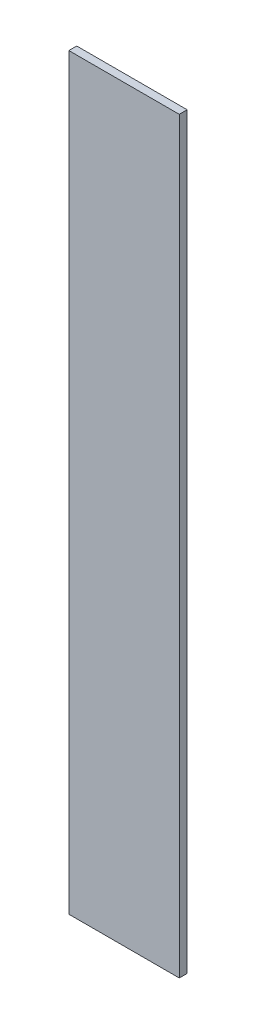
ISO-10303-21;
HEADER;
FILE_DESCRIPTION(('STEP AP214'),'2;1');
FILE_NAME('part.step','',(''),(''),'','','');
FILE_SCHEMA(('AUTOMOTIVE_DESIGN { 1 0 10303 214 1 1 1 1 }'));
ENDSEC;
DATA;
#1=APPLICATION_CONTEXT('core data for automotive mechanical design processes');
#2=APPLICATION_PROTOCOL_DEFINITION('international standard','automotive_design',2000,#1);
#3=PRODUCT_CONTEXT('',#1,'mechanical');
#4=PRODUCT('Part','Part','',(#3));
#5=PRODUCT_RELATED_PRODUCT_CATEGORY('part','',(#4));
#6=PRODUCT_DEFINITION_FORMATION('','',#4);
#7=PRODUCT_DEFINITION_CONTEXT('part definition',#1,'design');
#8=PRODUCT_DEFINITION('design','',#6,#7);
#9=PRODUCT_DEFINITION_SHAPE('','',#8);
#10=(LENGTH_UNIT() NAMED_UNIT(*) SI_UNIT(.MILLI.,.METRE.));
#11=(NAMED_UNIT(*) PLANE_ANGLE_UNIT() SI_UNIT($,.RADIAN.));
#12=(NAMED_UNIT(*) SI_UNIT($,.STERADIAN.) SOLID_ANGLE_UNIT());
#13=UNCERTAINTY_MEASURE_WITH_UNIT(LENGTH_MEASURE(1.E-05),#10,'distance_accuracy_value','');
#14=(GEOMETRIC_REPRESENTATION_CONTEXT(3) GLOBAL_UNCERTAINTY_ASSIGNED_CONTEXT((#13)) GLOBAL_UNIT_ASSIGNED_CONTEXT((#10,
#11,#12)) REPRESENTATION_CONTEXT('',''));
#15=CARTESIAN_POINT('',(0.,0.,0.));
#16=DIRECTION('',(0.,0.,1.));
#17=DIRECTION('',(1.,0.,0.));
#18=AXIS2_PLACEMENT_3D('',#15,#16,#17);
#19=CARTESIAN_POINT('',(0.,0.,6.35));
#20=DIRECTION('',(0.,1.,0.));
#21=DIRECTION('',(0.,0.,1.));
#22=AXIS2_PLACEMENT_3D('',#19,#20,#21);
#23=PLANE('',#22);
#24=DIRECTION('',(1.,0.,0.));
#25=VECTOR('',#24,1.);
#26=CARTESIAN_POINT('',(0.,0.,0.));
#27=LINE('',#26,#25);
#28=CARTESIAN_POINT('',(-88.9,0.,0.));
#29=VERTEX_POINT('',#28);
#30=CARTESIAN_POINT('',(0.,0.,0.));
#31=VERTEX_POINT('',#30);
#32=EDGE_CURVE('E113',#29,#31,#27,.T.);
#33=ORIENTED_EDGE('',*,*,#32,.T.);
#34=DIRECTION('',(0.,0.,-1.));
#35=VECTOR('',#34,1.);
#36=CARTESIAN_POINT('',(0.,0.,6.35));
#37=LINE('',#36,#35);
#38=CARTESIAN_POINT('',(0.,0.,6.35));
#39=VERTEX_POINT('',#38);
#40=EDGE_CURVE('E11',#39,#31,#37,.T.);
#41=ORIENTED_EDGE('',*,*,#40,.F.);
#42=DIRECTION('',(1.,0.,0.));
#43=VECTOR('',#42,1.);
#44=CARTESIAN_POINT('',(0.,0.,6.35));
#45=LINE('',#44,#43);
#46=CARTESIAN_POINT('',(-88.9,0.,6.35));
#47=VERTEX_POINT('',#46);
#48=EDGE_CURVE('E97',#47,#39,#45,.T.);
#49=ORIENTED_EDGE('',*,*,#48,.F.);
#50=DIRECTION('',(0.,0.,-1.));
#51=VECTOR('',#50,1.);
#52=CARTESIAN_POINT('',(-88.9,0.,6.35));
#53=LINE('',#52,#51);
#54=EDGE_CURVE('E109',#47,#29,#53,.T.);
#55=ORIENTED_EDGE('',*,*,#54,.T.);
#56=EDGE_LOOP('',(#33,#41,#49,#55));
#57=FACE_BOUND('',#56,.T.);
#58=ADVANCED_FACE('F45',(#57),#23,.F.);
#59=CARTESIAN_POINT('',(0.,0.,6.35));
#60=DIRECTION('',(-1.,0.,0.));
#61=DIRECTION('',(0.,0.,1.));
#62=AXIS2_PLACEMENT_3D('',#59,#60,#61);
#63=PLANE('',#62);
#64=DIRECTION('',(0.,1.,0.));
#65=VECTOR('',#64,1.);
#66=CARTESIAN_POINT('',(0.,0.,0.));
#67=LINE('',#66,#65);
#68=CARTESIAN_POINT('',(0.,602.234,0.));
#69=VERTEX_POINT('',#68);
#70=EDGE_CURVE('E102',#31,#69,#67,.T.);
#71=ORIENTED_EDGE('',*,*,#70,.T.);
#72=DIRECTION('',(0.,0.,-1.));
#73=VECTOR('',#72,1.);
#74=CARTESIAN_POINT('',(0.,602.234,6.35));
#75=LINE('',#74,#73);
#76=CARTESIAN_POINT('',(0.,602.234,6.35));
#77=VERTEX_POINT('',#76);
#78=EDGE_CURVE('E54',#77,#69,#75,.T.);
#79=ORIENTED_EDGE('',*,*,#78,.F.);
#80=DIRECTION('',(0.,1.,0.));
#81=VECTOR('',#80,1.);
#82=CARTESIAN_POINT('',(0.,0.,6.35));
#83=LINE('',#82,#81);
#84=EDGE_CURVE('E92',#39,#77,#83,.T.);
#85=ORIENTED_EDGE('',*,*,#84,.F.);
#86=ORIENTED_EDGE('',*,*,#40,.T.);
#87=EDGE_LOOP('',(#71,#79,#85,#86));
#88=FACE_BOUND('',#87,.T.);
#89=ADVANCED_FACE('F101',(#88),#63,.F.);
#90=CARTESIAN_POINT('',(0.,602.234,6.35));
#91=DIRECTION('',(0.,-1.,0.));
#92=DIRECTION('',(0.,0.,-1.));
#93=AXIS2_PLACEMENT_3D('',#90,#91,#92);
#94=PLANE('',#93);
#95=DIRECTION('',(-1.,0.,0.));
#96=VECTOR('',#95,1.);
#97=CARTESIAN_POINT('',(0.,602.234,0.));
#98=LINE('',#97,#96);
#99=CARTESIAN_POINT('',(-88.9,602.234,0.));
#100=VERTEX_POINT('',#99);
#101=EDGE_CURVE('E79',#69,#100,#98,.T.);
#102=ORIENTED_EDGE('',*,*,#101,.T.);
#103=DIRECTION('',(0.,0.,-1.));
#104=VECTOR('',#103,1.);
#105=CARTESIAN_POINT('',(-88.9,602.234,6.35));
#106=LINE('',#105,#104);
#107=CARTESIAN_POINT('',(-88.9,602.234,6.35));
#108=VERTEX_POINT('',#107);
#109=EDGE_CURVE('E104',#108,#100,#106,.T.);
#110=ORIENTED_EDGE('',*,*,#109,.F.);
#111=DIRECTION('',(-1.,0.,0.));
#112=VECTOR('',#111,1.);
#113=CARTESIAN_POINT('',(0.,602.234,6.35));
#114=LINE('',#113,#112);
#115=EDGE_CURVE('E95',#77,#108,#114,.T.);
#116=ORIENTED_EDGE('',*,*,#115,.F.);
#117=ORIENTED_EDGE('',*,*,#78,.T.);
#118=EDGE_LOOP('',(#102,#110,#116,#117));
#119=FACE_BOUND('',#118,.T.);
#120=ADVANCED_FACE('F105',(#119),#94,.F.);
#121=CARTESIAN_POINT('',(-88.9,0.,6.35));
#122=DIRECTION('',(1.,0.,0.));
#123=DIRECTION('',(0.,0.,-1.));
#124=AXIS2_PLACEMENT_3D('',#121,#122,#123);
#125=PLANE('',#124);
#126=DIRECTION('',(0.,-1.,0.));
#127=VECTOR('',#126,1.);
#128=CARTESIAN_POINT('',(-88.9,0.,0.));
#129=LINE('',#128,#127);
#130=EDGE_CURVE('E85',#100,#29,#129,.T.);
#131=ORIENTED_EDGE('',*,*,#130,.T.);
#132=ORIENTED_EDGE('',*,*,#54,.F.);
#133=DIRECTION('',(0.,-1.,0.));
#134=VECTOR('',#133,1.);
#135=CARTESIAN_POINT('',(-88.9,0.,6.35));
#136=LINE('',#135,#134);
#137=EDGE_CURVE('E62',#108,#47,#136,.T.);
#138=ORIENTED_EDGE('',*,*,#137,.F.);
#139=ORIENTED_EDGE('',*,*,#109,.T.);
#140=EDGE_LOOP('',(#131,#132,#138,#139));
#141=FACE_BOUND('',#140,.T.);
#142=ADVANCED_FACE('F126',(#141),#125,.F.);
#143=CARTESIAN_POINT('',(0.,0.,6.35));
#144=DIRECTION('',(0.,0.,-1.));
#145=DIRECTION('',(-1.,0.,0.));
#146=AXIS2_PLACEMENT_3D('',#143,#144,#145);
#147=PLANE('',#146);
#148=ORIENTED_EDGE('',*,*,#48,.T.);
#149=ORIENTED_EDGE('',*,*,#84,.T.);
#150=ORIENTED_EDGE('',*,*,#115,.T.);
#151=ORIENTED_EDGE('',*,*,#137,.T.);
#152=EDGE_LOOP('',(#148,#149,#150,#151));
#153=FACE_BOUND('',#152,.T.);
#154=ADVANCED_FACE('F93',(#153),#147,.F.);
#155=CARTESIAN_POINT('',(0.,0.,0.));
#156=DIRECTION('',(0.,0.,-1.));
#157=DIRECTION('',(-1.,0.,0.));
#158=AXIS2_PLACEMENT_3D('',#155,#156,#157);
#159=PLANE('',#158);
#160=ORIENTED_EDGE('',*,*,#32,.F.);
#161=ORIENTED_EDGE('',*,*,#130,.F.);
#162=ORIENTED_EDGE('',*,*,#101,.F.);
#163=ORIENTED_EDGE('',*,*,#70,.F.);
#164=EDGE_LOOP('',(#160,#161,#162,#163));
#165=FACE_BOUND('',#164,.T.);
#166=ADVANCED_FACE('F129',(#165),#159,.T.);
#167=CLOSED_SHELL('',(#58,#89,#120,#142,#154,#166));
#168=MANIFOLD_SOLID_BREP('B2',#167);
#169=ADVANCED_BREP_SHAPE_REPRESENTATION('',(#18,#168),#14);
#170=SHAPE_DEFINITION_REPRESENTATION(#9,#169);
ENDSEC;
END-ISO-10303-21;
